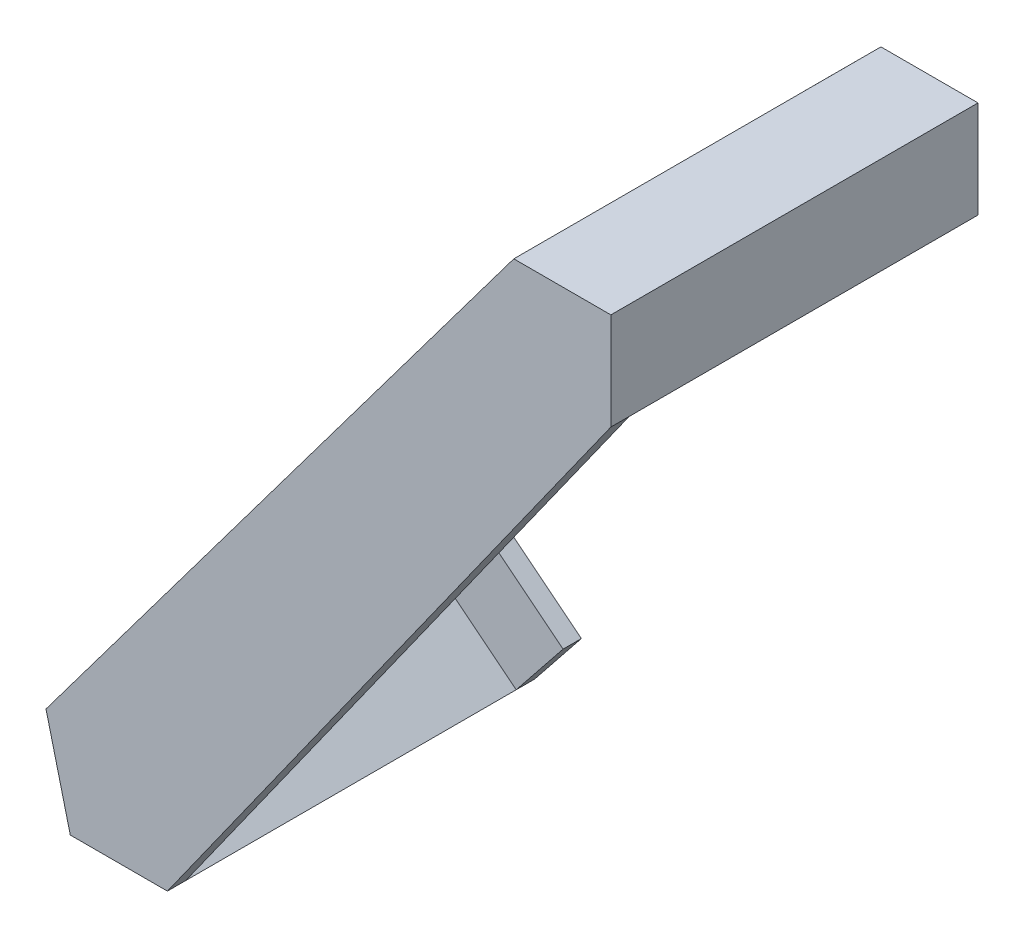
ISO-10303-21;
HEADER;
FILE_DESCRIPTION(('STEP AP214'),'2;1');
FILE_NAME('part.step','',(''),(''),'','','');
FILE_SCHEMA(('AUTOMOTIVE_DESIGN { 1 0 10303 214 1 1 1 1 }'));
ENDSEC;
DATA;
#1=APPLICATION_CONTEXT('core data for automotive mechanical design processes');
#2=APPLICATION_PROTOCOL_DEFINITION('international standard','automotive_design',2000,#1);
#3=PRODUCT_CONTEXT('',#1,'mechanical');
#4=PRODUCT('Part','Part','',(#3));
#5=PRODUCT_RELATED_PRODUCT_CATEGORY('part','',(#4));
#6=PRODUCT_DEFINITION_FORMATION('','',#4);
#7=PRODUCT_DEFINITION_CONTEXT('part definition',#1,'design');
#8=PRODUCT_DEFINITION('design','',#6,#7);
#9=PRODUCT_DEFINITION_SHAPE('','',#8);
#10=(LENGTH_UNIT() NAMED_UNIT(*) SI_UNIT(.MILLI.,.METRE.));
#11=(NAMED_UNIT(*) PLANE_ANGLE_UNIT() SI_UNIT($,.RADIAN.));
#12=(NAMED_UNIT(*) SI_UNIT($,.STERADIAN.) SOLID_ANGLE_UNIT());
#13=UNCERTAINTY_MEASURE_WITH_UNIT(LENGTH_MEASURE(1.E-05),#10,'distance_accuracy_value','');
#14=(GEOMETRIC_REPRESENTATION_CONTEXT(3) GLOBAL_UNCERTAINTY_ASSIGNED_CONTEXT((#13)) GLOBAL_UNIT_ASSIGNED_CONTEXT((#10,
#11,#12)) REPRESENTATION_CONTEXT('',''));
#15=CARTESIAN_POINT('',(0.,0.,0.));
#16=DIRECTION('',(0.,0.,1.));
#17=DIRECTION('',(1.,0.,0.));
#18=AXIS2_PLACEMENT_3D('',#15,#16,#17);
#19=CARTESIAN_POINT('',(-8.30619371938239,-42.7196308584084,-38.1));
#20=DIRECTION('',(-0.624315662685488,-0.781172166251192,0.));
#21=DIRECTION('',(0.781172166251192,-0.624315662685488,0.));
#22=AXIS2_PLACEMENT_3D('',#19,#20,#21);
#23=PLANE('',#22);
#24=DIRECTION('',(-0.781172166251192,0.624315662685488,0.));
#25=VECTOR('',#24,1.);
#26=CARTESIAN_POINT('',(-21.5693960658436,-32.1196308584084,-36.1));
#27=LINE('',#26,#25);
#28=CARTESIAN_POINT('',(-8.30619371938239,-42.7196308584084,-36.1));
#29=VERTEX_POINT('',#28);
#30=CARTESIAN_POINT('',(-21.5693960658436,-32.1196308584084,-36.1));
#31=VERTEX_POINT('',#30);
#32=EDGE_CURVE('E292',#29,#31,#27,.T.);
#33=ORIENTED_EDGE('',*,*,#32,.T.);
#34=DIRECTION('',(0.,0.,1.));
#35=VECTOR('',#34,1.);
#36=CARTESIAN_POINT('',(-21.5693960658436,-32.1196308584084,-38.1));
#37=LINE('',#36,#35);
#38=CARTESIAN_POINT('',(-21.5693960658436,-32.1196308584084,0.));
#39=VERTEX_POINT('',#38);
#40=EDGE_CURVE('E77',#31,#39,#37,.T.);
#41=ORIENTED_EDGE('',*,*,#40,.T.);
#42=DIRECTION('',(0.781172166251192,-0.624315662685488,0.));
#43=VECTOR('',#42,1.);
#44=CARTESIAN_POINT('',(-8.30619371938239,-42.7196308584084,0.));
#45=LINE('',#44,#43);
#46=CARTESIAN_POINT('',(-8.30619371938239,-42.7196308584084,0.));
#47=VERTEX_POINT('',#46);
#48=EDGE_CURVE('E178',#39,#47,#45,.T.);
#49=ORIENTED_EDGE('',*,*,#48,.T.);
#50=DIRECTION('',(0.,0.,1.));
#51=VECTOR('',#50,1.);
#52=CARTESIAN_POINT('',(-8.30619371938239,-42.7196308584084,-38.1));
#53=LINE('',#52,#51);
#54=EDGE_CURVE('E132',#29,#47,#53,.T.);
#55=ORIENTED_EDGE('',*,*,#54,.F.);
#56=EDGE_LOOP('',(#33,#41,#49,#55));
#57=FACE_BOUND('',#56,.T.);
#58=ADVANCED_FACE('F47',(#57),#23,.F.);
#59=CARTESIAN_POINT('',(29.5285871685704,36.0110134541436,2.));
#60=DIRECTION('',(0.,-1.,0.));
#61=DIRECTION('',(0.,0.,-1.));
#62=AXIS2_PLACEMENT_3D('',#59,#60,#61);
#63=PLANE('',#62);
#64=DIRECTION('',(0.,0.,-1.));
#65=VECTOR('',#64,1.);
#66=CARTESIAN_POINT('',(40.1317895150316,36.0110134541436,2.));
#67=LINE('',#66,#65);
#68=CARTESIAN_POINT('',(40.1317895150316,36.0110134541436,2.));
#69=VERTEX_POINT('',#68);
#70=CARTESIAN_POINT('',(40.1317895150316,36.0110134541436,-38.1));
#71=VERTEX_POINT('',#70);
#72=EDGE_CURVE('E87',#69,#71,#67,.T.);
#73=ORIENTED_EDGE('',*,*,#72,.T.);
#74=DIRECTION('',(1.,0.,0.));
#75=VECTOR('',#74,1.);
#76=CARTESIAN_POINT('',(40.1317895150316,36.0110134541436,-38.1));
#77=LINE('',#76,#75);
#78=CARTESIAN_POINT('',(29.5285871685704,36.0110134541436,-38.1));
#79=VERTEX_POINT('',#78);
#80=EDGE_CURVE('E194',#79,#71,#77,.T.);
#81=ORIENTED_EDGE('',*,*,#80,.F.);
#82=DIRECTION('',(0.,0.,1.));
#83=VECTOR('',#82,1.);
#84=CARTESIAN_POINT('',(29.5285871685704,36.0110134541436,-38.1));
#85=LINE('',#84,#83);
#86=CARTESIAN_POINT('',(29.5285871685704,36.0110134541436,-36.1));
#87=VERTEX_POINT('',#86);
#88=EDGE_CURVE('E200',#79,#87,#85,.T.);
#89=ORIENTED_EDGE('',*,*,#88,.T.);
#90=CARTESIAN_POINT('',(29.5285871685704,36.0110134541436,0.));
#91=VERTEX_POINT('',#90);
#92=EDGE_CURVE('E184',#87,#91,#85,.T.);
#93=ORIENTED_EDGE('',*,*,#92,.T.);
#94=DIRECTION('',(0.,0.,-1.));
#95=VECTOR('',#94,1.);
#96=CARTESIAN_POINT('',(29.5285871685704,36.0110134541436,2.));
#97=LINE('',#96,#95);
#98=CARTESIAN_POINT('',(29.5285871685704,36.0110134541436,2.));
#99=VERTEX_POINT('',#98);
#100=EDGE_CURVE('E11',#99,#91,#97,.T.);
#101=ORIENTED_EDGE('',*,*,#100,.F.);
#102=DIRECTION('',(-1.,0.,0.));
#103=VECTOR('',#102,1.);
#104=CARTESIAN_POINT('',(29.5285871685704,36.0110134541436,2.));
#105=LINE('',#104,#103);
#106=EDGE_CURVE('E156',#69,#99,#105,.T.);
#107=ORIENTED_EDGE('',*,*,#106,.F.);
#108=EDGE_LOOP('',(#73,#81,#89,#93,#101,#107));
#109=FACE_BOUND('',#108,.T.);
#110=ADVANCED_FACE('F49',(#109),#63,.F.);
#111=CARTESIAN_POINT('',(29.5285871685704,36.0110134541436,2.));
#112=DIRECTION('',(0.8,-0.6,0.));
#113=DIRECTION('',(0.6,0.8,0.));
#114=AXIS2_PLACEMENT_3D('',#111,#112,#113);
#115=PLANE('',#114);
#116=DIRECTION('',(-0.6,-0.8,0.));
#117=VECTOR('',#116,1.);
#118=CARTESIAN_POINT('',(29.5285871685704,36.0110134541436,0.));
#119=LINE('',#118,#117);
#120=EDGE_CURVE('E148',#91,#39,#119,.T.);
#121=ORIENTED_EDGE('',*,*,#120,.T.);
#122=DIRECTION('',(0.,0.,-1.));
#123=VECTOR('',#122,1.);
#124=CARTESIAN_POINT('',(-21.5693960658436,-32.1196308584084,2.));
#125=LINE('',#124,#123);
#126=CARTESIAN_POINT('',(-21.5693960658436,-32.1196308584084,2.));
#127=VERTEX_POINT('',#126);
#128=EDGE_CURVE('E57',#127,#39,#125,.T.);
#129=ORIENTED_EDGE('',*,*,#128,.F.);
#130=DIRECTION('',(-0.6,-0.8,0.));
#131=VECTOR('',#130,1.);
#132=CARTESIAN_POINT('',(29.5285871685704,36.0110134541436,2.));
#133=LINE('',#132,#131);
#134=EDGE_CURVE('E170',#99,#127,#133,.T.);
#135=ORIENTED_EDGE('',*,*,#134,.F.);
#136=ORIENTED_EDGE('',*,*,#100,.T.);
#137=EDGE_LOOP('',(#121,#129,#135,#136));
#138=FACE_BOUND('',#137,.T.);
#139=ADVANCED_FACE('F169',(#138),#115,.F.);
#140=CARTESIAN_POINT('',(-21.5693960658436,-32.1196308584084,2.));
#141=DIRECTION('',(0.970073503965093,0.242811443109437,0.));
#142=DIRECTION('',(-0.242811443109437,0.970073503965093,0.));
#143=AXIS2_PLACEMENT_3D('',#140,#141,#142);
#144=PLANE('',#143);
#145=ORIENTED_EDGE('',*,*,#128,.T.);
#146=ORIENTED_EDGE('',*,*,#40,.F.);
#147=CARTESIAN_POINT('',(-21.5693960658436,-32.1196308584084,-38.1));
#148=VERTEX_POINT('',#147);
#149=EDGE_CURVE('E206',#148,#31,#37,.T.);
#150=ORIENTED_EDGE('',*,*,#149,.F.);
#151=DIRECTION('',(-0.242811443109437,0.970073503965093,0.));
#152=VECTOR('',#151,1.);
#153=CARTESIAN_POINT('',(-21.5693960658436,-32.1196308584084,-38.1));
#154=LINE('',#153,#152);
#155=CARTESIAN_POINT('',(-18.9161937193824,-42.7196308584084,-38.1));
#156=VERTEX_POINT('',#155);
#157=EDGE_CURVE('E212',#156,#148,#154,.T.);
#158=ORIENTED_EDGE('',*,*,#157,.F.);
#159=DIRECTION('',(0.,0.,-1.));
#160=VECTOR('',#159,1.);
#161=CARTESIAN_POINT('',(-18.9161937193824,-42.7196308584084,2.));
#162=LINE('',#161,#160);
#163=CARTESIAN_POINT('',(-18.9161937193824,-42.7196308584084,2.));
#164=VERTEX_POINT('',#163);
#165=EDGE_CURVE('E137',#164,#156,#162,.T.);
#166=ORIENTED_EDGE('',*,*,#165,.F.);
#167=DIRECTION('',(0.242811443109437,-0.970073503965093,0.));
#168=VECTOR('',#167,1.);
#169=CARTESIAN_POINT('',(-21.5693960658436,-32.1196308584084,2.));
#170=LINE('',#169,#168);
#171=EDGE_CURVE('E122',#127,#164,#170,.T.);
#172=ORIENTED_EDGE('',*,*,#171,.F.);
#173=EDGE_LOOP('',(#145,#146,#150,#158,#166,#172));
#174=FACE_BOUND('',#173,.T.);
#175=ADVANCED_FACE('F166',(#174),#144,.F.);
#176=CARTESIAN_POINT('',(-18.9161937193824,-42.7196308584084,2.));
#177=DIRECTION('',(0.,1.,0.));
#178=DIRECTION('',(0.,0.,1.));
#179=AXIS2_PLACEMENT_3D('',#176,#177,#178);
#180=PLANE('',#179);
#181=ORIENTED_EDGE('',*,*,#165,.T.);
#182=DIRECTION('',(-1.,0.,0.));
#183=VECTOR('',#182,1.);
#184=CARTESIAN_POINT('',(-18.9161937193824,-42.7196308584084,-38.1));
#185=LINE('',#184,#183);
#186=CARTESIAN_POINT('',(-8.30619371938239,-42.7196308584084,-38.1));
#187=VERTEX_POINT('',#186);
#188=EDGE_CURVE('E196',#187,#156,#185,.T.);
#189=ORIENTED_EDGE('',*,*,#188,.F.);
#190=EDGE_CURVE('E210',#187,#29,#53,.T.);
#191=ORIENTED_EDGE('',*,*,#190,.T.);
#192=ORIENTED_EDGE('',*,*,#54,.T.);
#193=DIRECTION('',(0.,0.,-1.));
#194=VECTOR('',#193,1.);
#195=CARTESIAN_POINT('',(-8.30619371938239,-42.7196308584084,2.));
#196=LINE('',#195,#194);
#197=CARTESIAN_POINT('',(-8.30619371938239,-42.7196308584084,2.));
#198=VERTEX_POINT('',#197);
#199=EDGE_CURVE('E128',#198,#47,#196,.T.);
#200=ORIENTED_EDGE('',*,*,#199,.F.);
#201=DIRECTION('',(1.,0.,0.));
#202=VECTOR('',#201,1.);
#203=CARTESIAN_POINT('',(-18.9161937193824,-42.7196308584084,2.));
#204=LINE('',#203,#202);
#205=EDGE_CURVE('E115',#164,#198,#204,.T.);
#206=ORIENTED_EDGE('',*,*,#205,.F.);
#207=EDGE_LOOP('',(#181,#189,#191,#192,#200,#206));
#208=FACE_BOUND('',#207,.T.);
#209=ADVANCED_FACE('F129',(#208),#180,.F.);
#210=CARTESIAN_POINT('',(40.1317895150316,25.4010134541436,2.));
#211=DIRECTION('',(-0.814974330737056,0.579497058007794,0.));
#212=DIRECTION('',(-0.579497058007794,-0.814974330737056,0.));
#213=AXIS2_PLACEMENT_3D('',#210,#211,#212);
#214=PLANE('',#213);
#215=DIRECTION('',(0.579497058007794,0.814974330737056,0.));
#216=VECTOR('',#215,1.);
#217=CARTESIAN_POINT('',(40.1317895150316,25.4010134541436,0.));
#218=LINE('',#217,#216);
#219=CARTESIAN_POINT('',(40.1317895150316,25.4010134541436,0.));
#220=VERTEX_POINT('',#219);
#221=EDGE_CURVE('E152',#47,#220,#218,.T.);
#222=ORIENTED_EDGE('',*,*,#221,.T.);
#223=DIRECTION('',(0.,0.,-1.));
#224=VECTOR('',#223,1.);
#225=CARTESIAN_POINT('',(40.1317895150316,25.4010134541436,2.));
#226=LINE('',#225,#224);
#227=CARTESIAN_POINT('',(40.1317895150316,25.4010134541436,2.));
#228=VERTEX_POINT('',#227);
#229=EDGE_CURVE('E138',#228,#220,#226,.T.);
#230=ORIENTED_EDGE('',*,*,#229,.F.);
#231=DIRECTION('',(0.579497058007794,0.814974330737056,0.));
#232=VECTOR('',#231,1.);
#233=CARTESIAN_POINT('',(40.1317895150316,25.4010134541436,2.));
#234=LINE('',#233,#232);
#235=EDGE_CURVE('E119',#198,#228,#234,.T.);
#236=ORIENTED_EDGE('',*,*,#235,.F.);
#237=ORIENTED_EDGE('',*,*,#199,.T.);
#238=EDGE_LOOP('',(#222,#230,#236,#237));
#239=FACE_BOUND('',#238,.T.);
#240=ADVANCED_FACE('F140',(#239),#214,.F.);
#241=CARTESIAN_POINT('',(40.1317895150316,36.0110134541436,2.));
#242=DIRECTION('',(-1.,0.,0.));
#243=DIRECTION('',(0.,0.,1.));
#244=AXIS2_PLACEMENT_3D('',#241,#242,#243);
#245=PLANE('',#244);
#246=ORIENTED_EDGE('',*,*,#229,.T.);
#247=DIRECTION('',(0.,0.,1.));
#248=VECTOR('',#247,1.);
#249=CARTESIAN_POINT('',(40.1317895150316,25.4010134541436,-38.1));
#250=LINE('',#249,#248);
#251=CARTESIAN_POINT('',(40.1317895150316,25.4010134541436,-36.1));
#252=VERTEX_POINT('',#251);
#253=EDGE_CURVE('E187',#252,#220,#250,.T.);
#254=ORIENTED_EDGE('',*,*,#253,.F.);
#255=CARTESIAN_POINT('',(40.1317895150316,25.4010134541436,-38.1));
#256=VERTEX_POINT('',#255);
#257=EDGE_CURVE('E153',#256,#252,#250,.T.);
#258=ORIENTED_EDGE('',*,*,#257,.F.);
#259=DIRECTION('',(0.,-1.,0.));
#260=VECTOR('',#259,1.);
#261=CARTESIAN_POINT('',(40.1317895150316,25.4010134541436,-38.1));
#262=LINE('',#261,#260);
#263=EDGE_CURVE('E189',#71,#256,#262,.T.);
#264=ORIENTED_EDGE('',*,*,#263,.F.);
#265=ORIENTED_EDGE('',*,*,#72,.F.);
#266=DIRECTION('',(0.,1.,0.));
#267=VECTOR('',#266,1.);
#268=CARTESIAN_POINT('',(40.1317895150316,36.0110134541436,2.));
#269=LINE('',#268,#267);
#270=EDGE_CURVE('E65',#228,#69,#269,.T.);
#271=ORIENTED_EDGE('',*,*,#270,.F.);
#272=EDGE_LOOP('',(#246,#254,#258,#264,#265,#271));
#273=FACE_BOUND('',#272,.T.);
#274=ADVANCED_FACE('F238',(#273),#245,.F.);
#275=CARTESIAN_POINT('',(0.,0.,2.));
#276=DIRECTION('',(0.,0.,-1.));
#277=DIRECTION('',(-1.,0.,0.));
#278=AXIS2_PLACEMENT_3D('',#275,#276,#277);
#279=PLANE('',#278);
#280=ORIENTED_EDGE('',*,*,#106,.T.);
#281=ORIENTED_EDGE('',*,*,#134,.T.);
#282=ORIENTED_EDGE('',*,*,#171,.T.);
#283=ORIENTED_EDGE('',*,*,#205,.T.);
#284=ORIENTED_EDGE('',*,*,#235,.T.);
#285=ORIENTED_EDGE('',*,*,#270,.T.);
#286=EDGE_LOOP('',(#280,#281,#282,#283,#284,#285));
#287=FACE_BOUND('',#286,.T.);
#288=ADVANCED_FACE('F117',(#287),#279,.F.);
#289=CARTESIAN_POINT('',(0.,0.,0.));
#290=DIRECTION('',(0.,0.,-1.));
#291=DIRECTION('',(-1.,0.,0.));
#292=AXIS2_PLACEMENT_3D('',#289,#290,#291);
#293=PLANE('',#292);
#294=DIRECTION('',(-0.706880156430746,0.707333333333333,0.));
#295=VECTOR('',#294,1.);
#296=CARTESIAN_POINT('',(40.1317895150316,25.4010134541436,0.));
#297=LINE('',#296,#295);
#298=EDGE_CURVE('E177',#220,#91,#297,.T.);
#299=ORIENTED_EDGE('',*,*,#298,.F.);
#300=ORIENTED_EDGE('',*,*,#221,.F.);
#301=ORIENTED_EDGE('',*,*,#48,.F.);
#302=ORIENTED_EDGE('',*,*,#120,.F.);
#303=EDGE_LOOP('',(#299,#300,#301,#302));
#304=FACE_BOUND('',#303,.T.);
#305=ADVANCED_FACE('F176',(#304),#293,.T.);
#306=CARTESIAN_POINT('',(0.,0.,-38.1));
#307=DIRECTION('',(0.,0.,-1.));
#308=DIRECTION('',(-1.,0.,0.));
#309=AXIS2_PLACEMENT_3D('',#306,#307,#308);
#310=PLANE('',#309);
#311=ORIENTED_EDGE('',*,*,#188,.T.);
#312=ORIENTED_EDGE('',*,*,#157,.T.);
#313=DIRECTION('',(0.624315662685488,0.781172166251192,0.));
#314=VECTOR('',#313,1.);
#315=CARTESIAN_POINT('',(-21.5693960658436,-32.1196308584084,-38.1));
#316=LINE('',#315,#314);
#317=CARTESIAN_POINT('',(-16.4573262142894,-25.7231764385587,-38.1));
#318=VERTEX_POINT('',#317);
#319=EDGE_CURVE('E276',#148,#318,#316,.T.);
#320=ORIENTED_EDGE('',*,*,#319,.T.);
#321=DIRECTION('',(0.781172166251192,-0.624315662685488,0.));
#322=VECTOR('',#321,1.);
#323=CARTESIAN_POINT('',(-16.4573262142894,-25.7231764385587,-38.1));
#324=LINE('',#323,#322);
#325=CARTESIAN_POINT('',(-3.19412386782821,-36.3231764385587,-38.1));
#326=VERTEX_POINT('',#325);
#327=EDGE_CURVE('E300',#318,#326,#324,.T.);
#328=ORIENTED_EDGE('',*,*,#327,.T.);
#329=DIRECTION('',(-0.624315662685488,-0.781172166251192,0.));
#330=VECTOR('',#329,1.);
#331=CARTESIAN_POINT('',(-8.30619371938239,-42.7196308584084,-38.1));
#332=LINE('',#331,#330);
#333=EDGE_CURVE('E296',#326,#187,#332,.T.);
#334=ORIENTED_EDGE('',*,*,#333,.T.);
#335=EDGE_LOOP('',(#311,#312,#320,#328,#334));
#336=FACE_BOUND('',#335,.T.);
#337=ADVANCED_FACE('F350',(#336),#310,.T.);
#338=CARTESIAN_POINT('',(40.1317895150316,25.4010134541436,-38.1));
#339=DIRECTION('',(0.707333333333333,0.706880156430746,0.));
#340=DIRECTION('',(-0.706880156430746,0.707333333333333,0.));
#341=AXIS2_PLACEMENT_3D('',#338,#339,#340);
#342=PLANE('',#341);
#343=ORIENTED_EDGE('',*,*,#92,.F.);
#344=DIRECTION('',(0.706880156430746,-0.707333333333333,0.));
#345=VECTOR('',#344,1.);
#346=CARTESIAN_POINT('',(29.5285871685704,36.0110134541436,-36.1));
#347=LINE('',#346,#345);
#348=EDGE_CURVE('E258',#87,#252,#347,.T.);
#349=ORIENTED_EDGE('',*,*,#348,.T.);
#350=ORIENTED_EDGE('',*,*,#253,.T.);
#351=ORIENTED_EDGE('',*,*,#298,.T.);
#352=EDGE_LOOP('',(#343,#349,#350,#351));
#353=FACE_BOUND('',#352,.T.);
#354=ADVANCED_FACE('F181',(#353),#342,.F.);
#355=CARTESIAN_POINT('',(0.,0.,-38.1));
#356=DIRECTION('',(0.,0.,1.));
#357=DIRECTION('',(1.,0.,0.));
#358=AXIS2_PLACEMENT_3D('',#355,#356,#357);
#359=PLANE('',#358);
#360=ORIENTED_EDGE('',*,*,#263,.T.);
#361=DIRECTION('',(-0.707333333333333,-0.706880156430746,0.));
#362=VECTOR('',#361,1.);
#363=CARTESIAN_POINT('',(40.1317895150316,25.4010134541436,-38.1));
#364=LINE('',#363,#362);
#365=CARTESIAN_POINT('',(33.8638139959124,19.1370537244654,-38.1));
#366=VERTEX_POINT('',#365);
#367=EDGE_CURVE('E252',#256,#366,#364,.T.);
#368=ORIENTED_EDGE('',*,*,#367,.T.);
#369=DIRECTION('',(-0.706880156430746,0.707333333333333,0.));
#370=VECTOR('',#369,1.);
#371=CARTESIAN_POINT('',(23.2606116494512,29.7470537244654,-38.1));
#372=LINE('',#371,#370);
#373=CARTESIAN_POINT('',(23.2606116494512,29.7470537244654,-38.1));
#374=VERTEX_POINT('',#373);
#375=EDGE_CURVE('E268',#366,#374,#372,.T.);
#376=ORIENTED_EDGE('',*,*,#375,.T.);
#377=DIRECTION('',(0.707333333333333,0.706880156430746,0.));
#378=VECTOR('',#377,1.);
#379=CARTESIAN_POINT('',(29.5285871685704,36.0110134541436,-38.1));
#380=LINE('',#379,#378);
#381=EDGE_CURVE('E235',#374,#79,#380,.T.);
#382=ORIENTED_EDGE('',*,*,#381,.T.);
#383=ORIENTED_EDGE('',*,*,#80,.T.);
#384=EDGE_LOOP('',(#360,#368,#376,#382,#383));
#385=FACE_BOUND('',#384,.T.);
#386=ADVANCED_FACE('F229',(#385),#359,.F.);
#387=CARTESIAN_POINT('',(29.5285871685704,36.0110134541436,-36.1));
#388=DIRECTION('',(-0.706880156430746,0.707333333333333,0.));
#389=DIRECTION('',(-0.707333333333333,-0.706880156430746,0.));
#390=AXIS2_PLACEMENT_3D('',#387,#388,#389);
#391=PLANE('',#390);
#392=ORIENTED_EDGE('',*,*,#381,.F.);
#393=DIRECTION('',(0.,0.,-1.));
#394=VECTOR('',#393,1.);
#395=CARTESIAN_POINT('',(23.2606116494512,29.7470537244654,-36.1));
#396=LINE('',#395,#394);
#397=CARTESIAN_POINT('',(23.2606116494512,29.7470537244654,-36.1));
#398=VERTEX_POINT('',#397);
#399=EDGE_CURVE('E281',#398,#374,#396,.T.);
#400=ORIENTED_EDGE('',*,*,#399,.F.);
#401=DIRECTION('',(0.707333333333333,0.706880156430746,0.));
#402=VECTOR('',#401,1.);
#403=CARTESIAN_POINT('',(29.5285871685704,36.0110134541436,-36.1));
#404=LINE('',#403,#402);
#405=EDGE_CURVE('E265',#398,#87,#404,.T.);
#406=ORIENTED_EDGE('',*,*,#405,.T.);
#407=ORIENTED_EDGE('',*,*,#88,.F.);
#408=EDGE_LOOP('',(#392,#400,#406,#407));
#409=FACE_BOUND('',#408,.T.);
#410=ADVANCED_FACE('F366',(#409),#391,.T.);
#411=CARTESIAN_POINT('',(23.2606116494512,29.7470537244654,-36.1));
#412=DIRECTION('',(-0.707333333333333,-0.706880156430746,0.));
#413=DIRECTION('',(0.706880156430746,-0.707333333333333,0.));
#414=AXIS2_PLACEMENT_3D('',#411,#412,#413);
#415=PLANE('',#414);
#416=ORIENTED_EDGE('',*,*,#375,.F.);
#417=DIRECTION('',(0.,0.,-1.));
#418=VECTOR('',#417,1.);
#419=CARTESIAN_POINT('',(33.8638139959124,19.1370537244654,-36.1));
#420=LINE('',#419,#418);
#421=CARTESIAN_POINT('',(33.8638139959124,19.1370537244654,-36.1));
#422=VERTEX_POINT('',#421);
#423=EDGE_CURVE('E273',#422,#366,#420,.T.);
#424=ORIENTED_EDGE('',*,*,#423,.F.);
#425=DIRECTION('',(-0.706880156430746,0.707333333333333,0.));
#426=VECTOR('',#425,1.);
#427=CARTESIAN_POINT('',(23.2606116494512,29.7470537244654,-36.1));
#428=LINE('',#427,#426);
#429=EDGE_CURVE('E261',#422,#398,#428,.T.);
#430=ORIENTED_EDGE('',*,*,#429,.T.);
#431=ORIENTED_EDGE('',*,*,#399,.T.);
#432=EDGE_LOOP('',(#416,#424,#430,#431));
#433=FACE_BOUND('',#432,.T.);
#434=ADVANCED_FACE('F364',(#433),#415,.T.);
#435=CARTESIAN_POINT('',(40.1317895150316,25.4010134541436,-36.1));
#436=DIRECTION('',(0.706880156430746,-0.707333333333333,0.));
#437=DIRECTION('',(0.707333333333333,0.706880156430746,0.));
#438=AXIS2_PLACEMENT_3D('',#435,#436,#437);
#439=PLANE('',#438);
#440=ORIENTED_EDGE('',*,*,#367,.F.);
#441=ORIENTED_EDGE('',*,*,#257,.T.);
#442=DIRECTION('',(-0.707333333333333,-0.706880156430746,0.));
#443=VECTOR('',#442,1.);
#444=CARTESIAN_POINT('',(40.1317895150316,25.4010134541436,-36.1));
#445=LINE('',#444,#443);
#446=EDGE_CURVE('E250',#252,#422,#445,.T.);
#447=ORIENTED_EDGE('',*,*,#446,.T.);
#448=ORIENTED_EDGE('',*,*,#423,.T.);
#449=EDGE_LOOP('',(#440,#441,#447,#448));
#450=FACE_BOUND('',#449,.T.);
#451=ADVANCED_FACE('F247',(#450),#439,.T.);
#452=CARTESIAN_POINT('',(0.,0.,-36.1));
#453=DIRECTION('',(0.,0.,1.));
#454=DIRECTION('',(1.,0.,0.));
#455=AXIS2_PLACEMENT_3D('',#452,#453,#454);
#456=PLANE('',#455);
#457=ORIENTED_EDGE('',*,*,#405,.F.);
#458=ORIENTED_EDGE('',*,*,#429,.F.);
#459=ORIENTED_EDGE('',*,*,#446,.F.);
#460=ORIENTED_EDGE('',*,*,#348,.F.);
#461=EDGE_LOOP('',(#457,#458,#459,#460));
#462=FACE_BOUND('',#461,.T.);
#463=ADVANCED_FACE('F257',(#462),#456,.T.);
#464=CARTESIAN_POINT('',(-21.5693960658436,-32.1196308584084,-36.1));
#465=DIRECTION('',(-0.781172166251192,0.624315662685488,0.));
#466=DIRECTION('',(-0.624315662685488,-0.781172166251192,0.));
#467=AXIS2_PLACEMENT_3D('',#464,#465,#466);
#468=PLANE('',#467);
#469=ORIENTED_EDGE('',*,*,#319,.F.);
#470=ORIENTED_EDGE('',*,*,#149,.T.);
#471=DIRECTION('',(0.624315662685488,0.781172166251192,0.));
#472=VECTOR('',#471,1.);
#473=CARTESIAN_POINT('',(-21.5693960658436,-32.1196308584084,-36.1));
#474=LINE('',#473,#472);
#475=CARTESIAN_POINT('',(-16.4573262142894,-25.7231764385587,-36.1));
#476=VERTEX_POINT('',#475);
#477=EDGE_CURVE('E299',#31,#476,#474,.T.);
#478=ORIENTED_EDGE('',*,*,#477,.T.);
#479=DIRECTION('',(0.,0.,-1.));
#480=VECTOR('',#479,1.);
#481=CARTESIAN_POINT('',(-16.4573262142894,-25.7231764385587,-36.1));
#482=LINE('',#481,#480);
#483=EDGE_CURVE('E287',#476,#318,#482,.T.);
#484=ORIENTED_EDGE('',*,*,#483,.T.);
#485=EDGE_LOOP('',(#469,#470,#478,#484));
#486=FACE_BOUND('',#485,.T.);
#487=ADVANCED_FACE('F323',(#486),#468,.T.);
#488=CARTESIAN_POINT('',(-8.30619371938239,-42.7196308584084,-36.1));
#489=DIRECTION('',(0.781172166251192,-0.624315662685488,0.));
#490=DIRECTION('',(0.624315662685488,0.781172166251192,0.));
#491=AXIS2_PLACEMENT_3D('',#488,#489,#490);
#492=PLANE('',#491);
#493=ORIENTED_EDGE('',*,*,#333,.F.);
#494=DIRECTION('',(0.,0.,-1.));
#495=VECTOR('',#494,1.);
#496=CARTESIAN_POINT('',(-3.19412386782821,-36.3231764385587,-36.1));
#497=LINE('',#496,#495);
#498=CARTESIAN_POINT('',(-3.19412386782821,-36.3231764385587,-36.1));
#499=VERTEX_POINT('',#498);
#500=EDGE_CURVE('E291',#499,#326,#497,.T.);
#501=ORIENTED_EDGE('',*,*,#500,.F.);
#502=DIRECTION('',(-0.624315662685488,-0.781172166251192,0.));
#503=VECTOR('',#502,1.);
#504=CARTESIAN_POINT('',(-8.30619371938239,-42.7196308584084,-36.1));
#505=LINE('',#504,#503);
#506=EDGE_CURVE('E309',#499,#29,#505,.T.);
#507=ORIENTED_EDGE('',*,*,#506,.T.);
#508=ORIENTED_EDGE('',*,*,#190,.F.);
#509=EDGE_LOOP('',(#493,#501,#507,#508));
#510=FACE_BOUND('',#509,.T.);
#511=ADVANCED_FACE('F342',(#510),#492,.T.);
#512=CARTESIAN_POINT('',(-16.4573262142894,-25.7231764385587,-36.1));
#513=DIRECTION('',(0.624315662685488,0.781172166251192,0.));
#514=DIRECTION('',(-0.781172166251192,0.624315662685488,0.));
#515=AXIS2_PLACEMENT_3D('',#512,#513,#514);
#516=PLANE('',#515);
#517=ORIENTED_EDGE('',*,*,#327,.F.);
#518=ORIENTED_EDGE('',*,*,#483,.F.);
#519=DIRECTION('',(0.781172166251192,-0.624315662685488,0.));
#520=VECTOR('',#519,1.);
#521=CARTESIAN_POINT('',(-16.4573262142894,-25.7231764385587,-36.1));
#522=LINE('',#521,#520);
#523=EDGE_CURVE('E313',#476,#499,#522,.T.);
#524=ORIENTED_EDGE('',*,*,#523,.T.);
#525=ORIENTED_EDGE('',*,*,#500,.T.);
#526=EDGE_LOOP('',(#517,#518,#524,#525));
#527=FACE_BOUND('',#526,.T.);
#528=ADVANCED_FACE('F347',(#527),#516,.T.);
#529=CARTESIAN_POINT('',(0.,0.,-36.1));
#530=DIRECTION('',(0.,0.,-1.));
#531=DIRECTION('',(-1.,0.,0.));
#532=AXIS2_PLACEMENT_3D('',#529,#530,#531);
#533=PLANE('',#532);
#534=ORIENTED_EDGE('',*,*,#477,.F.);
#535=ORIENTED_EDGE('',*,*,#32,.F.);
#536=ORIENTED_EDGE('',*,*,#506,.F.);
#537=ORIENTED_EDGE('',*,*,#523,.F.);
#538=EDGE_LOOP('',(#534,#535,#536,#537));
#539=FACE_BOUND('',#538,.T.);
#540=ADVANCED_FACE('F332',(#539),#533,.F.);
#541=CLOSED_SHELL('',(#58,#110,#139,#175,#209,#240,#274,#288,#305,#337,#354,#386,#410,#434,#451,
#463,#487,#511,#528,#540));
#542=MANIFOLD_SOLID_BREP('B2',#541);
#543=ADVANCED_BREP_SHAPE_REPRESENTATION('',(#18,#542),#14);
#544=SHAPE_DEFINITION_REPRESENTATION(#9,#543);
ENDSEC;
END-ISO-10303-21;
